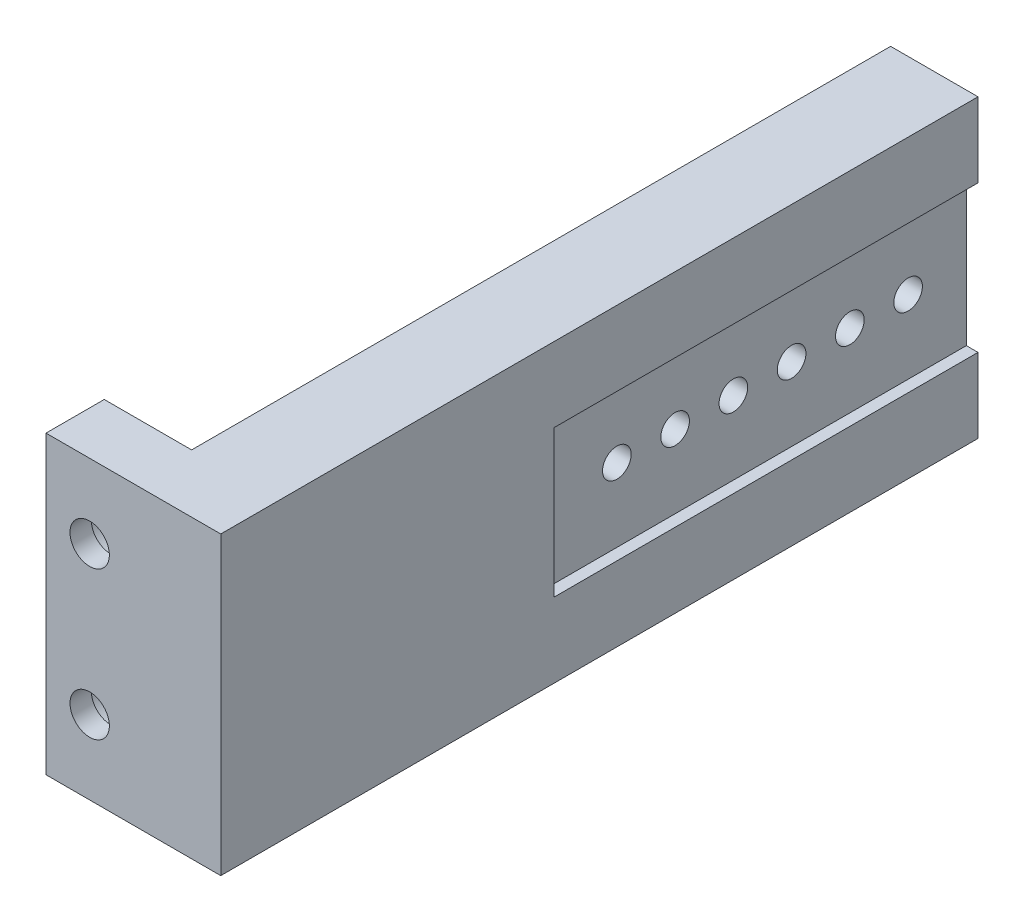
ISO-10303-21;
HEADER;
FILE_DESCRIPTION(('STEP AP214'),'2;1');
FILE_NAME('part.step','',(''),(''),'','','');
FILE_SCHEMA(('AUTOMOTIVE_DESIGN { 1 0 10303 214 1 1 1 1 }'));
ENDSEC;
DATA;
#1=APPLICATION_CONTEXT('core data for automotive mechanical design processes');
#2=APPLICATION_PROTOCOL_DEFINITION('international standard','automotive_design',2000,#1);
#3=PRODUCT_CONTEXT('',#1,'mechanical');
#4=PRODUCT('Part','Part','',(#3));
#5=PRODUCT_RELATED_PRODUCT_CATEGORY('part','',(#4));
#6=PRODUCT_DEFINITION_FORMATION('','',#4);
#7=PRODUCT_DEFINITION_CONTEXT('part definition',#1,'design');
#8=PRODUCT_DEFINITION('design','',#6,#7);
#9=PRODUCT_DEFINITION_SHAPE('','',#8);
#10=(LENGTH_UNIT() NAMED_UNIT(*) SI_UNIT(.MILLI.,.METRE.));
#11=(NAMED_UNIT(*) PLANE_ANGLE_UNIT() SI_UNIT($,.RADIAN.));
#12=(NAMED_UNIT(*) SI_UNIT($,.STERADIAN.) SOLID_ANGLE_UNIT());
#13=UNCERTAINTY_MEASURE_WITH_UNIT(LENGTH_MEASURE(1.E-05),#10,'distance_accuracy_value','');
#14=(GEOMETRIC_REPRESENTATION_CONTEXT(3) GLOBAL_UNCERTAINTY_ASSIGNED_CONTEXT((#13)) GLOBAL_UNIT_ASSIGNED_CONTEXT((#10,
#11,#12)) REPRESENTATION_CONTEXT('',''));
#15=CARTESIAN_POINT('',(0.,0.,0.));
#16=DIRECTION('',(0.,0.,1.));
#17=DIRECTION('',(1.,0.,0.));
#18=AXIS2_PLACEMENT_3D('',#15,#16,#17);
#19=CARTESIAN_POINT('',(-82.9026548672566,50.8,0.));
#20=DIRECTION('',(1.,0.,0.));
#21=DIRECTION('',(0.,0.,-1.));
#22=AXIS2_PLACEMENT_3D('',#19,#20,#21);
#23=PLANE('',#22);
#24=CARTESIAN_POINT('',(-82.9026548672566,25.4,-13.5132743362832));
#25=DIRECTION('',(1.,0.,0.));
#26=DIRECTION('',(0.,0.,-1.));
#27=AXIS2_PLACEMENT_3D('',#24,#25,#26);
#28=CIRCLE('',#27,2.45744999999999);
#29=CARTESIAN_POINT('',(-82.9026548672566,25.4,-15.9707243362832));
#30=VERTEX_POINT('',#29);
#31=EDGE_CURVE('E11',#30,#30,#28,.T.);
#32=ORIENTED_EDGE('',*,*,#31,.T.);
#33=EDGE_LOOP('',(#32));
#34=FACE_BOUND('',#33,.T.);
#35=CARTESIAN_POINT('',(-82.9026548672566,25.4,-23.5132743362832));
#36=DIRECTION('',(1.,0.,0.));
#37=DIRECTION('',(0.,0.,-1.));
#38=AXIS2_PLACEMENT_3D('',#35,#36,#37);
#39=CIRCLE('',#38,2.45744999999999);
#40=CARTESIAN_POINT('',(-82.9026548672566,25.4,-25.9707243362832));
#41=VERTEX_POINT('',#40);
#42=EDGE_CURVE('E45',#41,#41,#39,.T.);
#43=ORIENTED_EDGE('',*,*,#42,.T.);
#44=EDGE_LOOP('',(#43));
#45=FACE_BOUND('',#44,.T.);
#46=CARTESIAN_POINT('',(-82.9026548672566,25.4,-53.5132743362832));
#47=DIRECTION('',(1.,0.,0.));
#48=DIRECTION('',(0.,0.,-1.));
#49=AXIS2_PLACEMENT_3D('',#46,#47,#48);
#50=CIRCLE('',#49,2.45744999999999);
#51=CARTESIAN_POINT('',(-82.9026548672566,25.4,-55.9707243362832));
#52=VERTEX_POINT('',#51);
#53=EDGE_CURVE('E272',#52,#52,#50,.T.);
#54=ORIENTED_EDGE('',*,*,#53,.T.);
#55=EDGE_LOOP('',(#54));
#56=FACE_BOUND('',#55,.T.);
#57=CARTESIAN_POINT('',(-82.9026548672566,25.4,-63.5132743362832));
#58=DIRECTION('',(1.,0.,0.));
#59=DIRECTION('',(0.,0.,-1.));
#60=AXIS2_PLACEMENT_3D('',#57,#58,#59);
#61=CIRCLE('',#60,2.45744999999999);
#62=CARTESIAN_POINT('',(-82.9026548672566,25.4,-65.9707243362832));
#63=VERTEX_POINT('',#62);
#64=EDGE_CURVE('E269',#63,#63,#61,.T.);
#65=ORIENTED_EDGE('',*,*,#64,.T.);
#66=EDGE_LOOP('',(#65));
#67=FACE_BOUND('',#66,.T.);
#68=CARTESIAN_POINT('',(-82.9026548672566,25.4,-43.5132743362832));
#69=DIRECTION('',(1.,0.,0.));
#70=DIRECTION('',(0.,0.,-1.));
#71=AXIS2_PLACEMENT_3D('',#68,#69,#70);
#72=CIRCLE('',#71,2.45744999999999);
#73=CARTESIAN_POINT('',(-82.9026548672566,25.4,-45.9707243362832));
#74=VERTEX_POINT('',#73);
#75=EDGE_CURVE('E266',#74,#74,#72,.T.);
#76=ORIENTED_EDGE('',*,*,#75,.T.);
#77=EDGE_LOOP('',(#76));
#78=FACE_BOUND('',#77,.T.);
#79=CARTESIAN_POINT('',(-82.9026548672566,25.4,-33.5132743362832));
#80=DIRECTION('',(1.,0.,0.));
#81=DIRECTION('',(0.,0.,-1.));
#82=AXIS2_PLACEMENT_3D('',#79,#80,#81);
#83=CIRCLE('',#82,2.45744999999999);
#84=CARTESIAN_POINT('',(-82.9026548672566,25.4,-35.9707243362832));
#85=VERTEX_POINT('',#84);
#86=EDGE_CURVE('E263',#85,#85,#83,.T.);
#87=ORIENTED_EDGE('',*,*,#86,.T.);
#88=EDGE_LOOP('',(#87));
#89=FACE_BOUND('',#88,.T.);
#90=DIRECTION('',(0.,0.,1.));
#91=VECTOR('',#90,1.);
#92=CARTESIAN_POINT('',(-82.9026548672566,22.7,36.4867256637168));
#93=LINE('',#92,#91);
#94=CARTESIAN_POINT('',(-82.9026548672566,22.7,10.5059635501835));
#95=VERTEX_POINT('',#94);
#96=CARTESIAN_POINT('',(-82.9026548672566,22.7,46.4867256637168));
#97=VERTEX_POINT('',#96);
#98=EDGE_CURVE('E220',#95,#97,#93,.T.);
#99=ORIENTED_EDGE('',*,*,#98,.F.);
#100=DIRECTION('',(0.,1.,0.));
#101=VECTOR('',#100,1.);
#102=CARTESIAN_POINT('',(-82.9026548672566,50.8,10.5059635501835));
#103=LINE('',#102,#101);
#104=CARTESIAN_POINT('',(-82.9026548672566,28.1,10.5059635501835));
#105=VERTEX_POINT('',#104);
#106=EDGE_CURVE('E207',#105,#95,#103,.F.);
#107=ORIENTED_EDGE('',*,*,#106,.F.);
#108=DIRECTION('',(0.,0.,1.));
#109=VECTOR('',#108,1.);
#110=CARTESIAN_POINT('',(-82.9026548672566,28.1,36.4867256637168));
#111=LINE('',#110,#109);
#112=CARTESIAN_POINT('',(-82.9026548672566,28.1,46.4867256637168));
#113=VERTEX_POINT('',#112);
#114=EDGE_CURVE('E209',#105,#113,#111,.T.);
#115=ORIENTED_EDGE('',*,*,#114,.T.);
#116=DIRECTION('',(0.,-1.,0.));
#117=VECTOR('',#116,1.);
#118=CARTESIAN_POINT('',(-82.9026548672566,50.8,46.4867256637168));
#119=LINE('',#118,#117);
#120=CARTESIAN_POINT('',(-82.9026548672566,50.8,46.4867256637168));
#121=VERTEX_POINT('',#120);
#122=EDGE_CURVE('E191',#121,#113,#119,.T.);
#123=ORIENTED_EDGE('',*,*,#122,.F.);
#124=DIRECTION('',(0.,0.,1.));
#125=VECTOR('',#124,1.);
#126=CARTESIAN_POINT('',(-82.9026548672566,50.8,0.));
#127=LINE('',#126,#125);
#128=CARTESIAN_POINT('',(-82.9026548672566,50.8,-73.5132743362832));
#129=VERTEX_POINT('',#128);
#130=EDGE_CURVE('E299',#129,#121,#127,.T.);
#131=ORIENTED_EDGE('',*,*,#130,.F.);
#132=DIRECTION('',(0.,-1.,0.));
#133=VECTOR('',#132,1.);
#134=CARTESIAN_POINT('',(-82.9026548672566,50.8,-73.5132743362832));
#135=LINE('',#134,#133);
#136=CARTESIAN_POINT('',(-82.9026548672566,0.,-73.5132743362832));
#137=VERTEX_POINT('',#136);
#138=EDGE_CURVE('E194',#129,#137,#135,.T.);
#139=ORIENTED_EDGE('',*,*,#138,.T.);
#140=DIRECTION('',(0.,0.,1.));
#141=VECTOR('',#140,1.);
#142=CARTESIAN_POINT('',(-82.9026548672566,0.,0.));
#143=LINE('',#142,#141);
#144=CARTESIAN_POINT('',(-82.9026548672566,0.,46.4867256637168));
#145=VERTEX_POINT('',#144);
#146=EDGE_CURVE('E171',#137,#145,#143,.T.);
#147=ORIENTED_EDGE('',*,*,#146,.T.);
#148=EDGE_CURVE('E190',#97,#145,#119,.T.);
#149=ORIENTED_EDGE('',*,*,#148,.F.);
#150=EDGE_LOOP('',(#99,#107,#115,#123,#131,#139,#147,#149));
#151=FACE_BOUND('',#150,.T.);
#152=ADVANCED_FACE('F35',(#34,#45,#56,#67,#78,#89,#151),#23,.F.);
#153=CARTESIAN_POINT('',(0.,50.8,46.4867256637168));
#154=DIRECTION('',(0.,0.,1.));
#155=DIRECTION('',(1.,0.,0.));
#156=AXIS2_PLACEMENT_3D('',#153,#154,#155);
#157=PLANE('',#156);
#158=CARTESIAN_POINT('',(-90.4026548672566,12.7,46.4867256637168));
#159=DIRECTION('',(0.,0.,-1.));
#160=DIRECTION('',(-1.,0.,0.));
#161=AXIS2_PLACEMENT_3D('',#158,#159,#160);
#162=CIRCLE('',#161,5.55625);
#163=CARTESIAN_POINT('',(-95.9589048672566,12.7,46.4867256637168));
#164=VERTEX_POINT('',#163);
#165=EDGE_CURVE('E275',#164,#164,#162,.T.);
#166=ORIENTED_EDGE('',*,*,#165,.F.);
#167=EDGE_LOOP('',(#166));
#168=FACE_BOUND('',#167,.T.);
#169=DIRECTION('',(-1.,0.,0.));
#170=VECTOR('',#169,1.);
#171=CARTESIAN_POINT('',(-82.9026548672566,22.7,46.4867256637168));
#172=LINE('',#171,#170);
#173=CARTESIAN_POINT('',(-97.9026548672566,22.7,46.4867256637168));
#174=VERTEX_POINT('',#173);
#175=EDGE_CURVE('E215',#97,#174,#172,.T.);
#176=ORIENTED_EDGE('',*,*,#175,.F.);
#177=ORIENTED_EDGE('',*,*,#148,.T.);
#178=DIRECTION('',(-1.,0.,0.));
#179=VECTOR('',#178,1.);
#180=CARTESIAN_POINT('',(0.,0.,46.4867256637168));
#181=LINE('',#180,#179);
#182=CARTESIAN_POINT('',(-97.9026548672566,0.,46.4867256637168));
#183=VERTEX_POINT('',#182);
#184=EDGE_CURVE('E181',#145,#183,#181,.T.);
#185=ORIENTED_EDGE('',*,*,#184,.T.);
#186=DIRECTION('',(0.,-1.,0.));
#187=VECTOR('',#186,1.);
#188=CARTESIAN_POINT('',(-97.9026548672566,50.8,46.4867256637168));
#189=LINE('',#188,#187);
#190=EDGE_CURVE('E186',#174,#183,#189,.T.);
#191=ORIENTED_EDGE('',*,*,#190,.F.);
#192=EDGE_LOOP('',(#176,#177,#185,#191));
#193=FACE_BOUND('',#192,.T.);
#194=ADVANCED_FACE('F328',(#168,#193),#157,.F.);
#195=CARTESIAN_POINT('',(-90.4026548672566,38.1,46.4867256637168));
#196=DIRECTION('',(0.,0.,-1.));
#197=DIRECTION('',(-1.,0.,0.));
#198=AXIS2_PLACEMENT_3D('',#195,#196,#197);
#199=CIRCLE('',#198,5.55625);
#200=CARTESIAN_POINT('',(-95.9589048672566,38.1,46.4867256637168));
#201=VERTEX_POINT('',#200);
#202=EDGE_CURVE('E287',#201,#201,#199,.T.);
#203=ORIENTED_EDGE('',*,*,#202,.F.);
#204=EDGE_LOOP('',(#203));
#205=FACE_BOUND('',#204,.T.);
#206=DIRECTION('',(1.,0.,0.));
#207=VECTOR('',#206,1.);
#208=CARTESIAN_POINT('',(-82.9026548672566,28.1,46.4867256637168));
#209=LINE('',#208,#207);
#210=CARTESIAN_POINT('',(-97.9026548672566,28.1,46.4867256637168));
#211=VERTEX_POINT('',#210);
#212=EDGE_CURVE('E208',#211,#113,#209,.T.);
#213=ORIENTED_EDGE('',*,*,#212,.F.);
#214=CARTESIAN_POINT('',(-97.9026548672566,50.8,46.4867256637168));
#215=VERTEX_POINT('',#214);
#216=EDGE_CURVE('E187',#215,#211,#189,.T.);
#217=ORIENTED_EDGE('',*,*,#216,.F.);
#218=DIRECTION('',(-1.,0.,0.));
#219=VECTOR('',#218,1.);
#220=CARTESIAN_POINT('',(0.,50.8,46.4867256637168));
#221=LINE('',#220,#219);
#222=EDGE_CURVE('E301',#121,#215,#221,.T.);
#223=ORIENTED_EDGE('',*,*,#222,.F.);
#224=ORIENTED_EDGE('',*,*,#122,.T.);
#225=EDGE_LOOP('',(#213,#217,#223,#224));
#226=FACE_BOUND('',#225,.T.);
#227=ADVANCED_FACE('F314',(#205,#226),#157,.F.);
#228=CARTESIAN_POINT('',(-67.9026548672567,25.4,-13.5132743362832));
#229=DIRECTION('',(1.,0.,0.));
#230=DIRECTION('',(0.,0.,-1.));
#231=AXIS2_PLACEMENT_3D('',#228,#229,#230);
#232=CYLINDRICAL_SURFACE('',#231,2.45744999999999);
#233=CARTESIAN_POINT('',(-69.9026548672566,25.4,-13.5132743362832));
#234=DIRECTION('',(-1.,0.,0.));
#235=DIRECTION('',(0.,0.,1.));
#236=AXIS2_PLACEMENT_3D('',#233,#234,#235);
#237=CIRCLE('',#236,2.45744999999999);
#238=CARTESIAN_POINT('',(-69.9026548672566,25.4,-11.0558243362832));
#239=VERTEX_POINT('',#238);
#240=EDGE_CURVE('E260',#239,#239,#237,.F.);
#241=ORIENTED_EDGE('',*,*,#240,.T.);
#242=EDGE_LOOP('',(#241));
#243=FACE_BOUND('',#242,.T.);
#244=ORIENTED_EDGE('',*,*,#31,.F.);
#245=EDGE_LOOP('',(#244));
#246=FACE_BOUND('',#245,.T.);
#247=ADVANCED_FACE('F358',(#243,#246),#232,.F.);
#248=CARTESIAN_POINT('',(-67.9026548672567,25.4,-23.5132743362832));
#249=DIRECTION('',(1.,0.,0.));
#250=DIRECTION('',(0.,0.,-1.));
#251=AXIS2_PLACEMENT_3D('',#248,#249,#250);
#252=CYLINDRICAL_SURFACE('',#251,2.45744999999999);
#253=CARTESIAN_POINT('',(-69.9026548672566,25.4,-23.5132743362832));
#254=DIRECTION('',(-1.,0.,0.));
#255=DIRECTION('',(0.,0.,1.));
#256=AXIS2_PLACEMENT_3D('',#253,#254,#255);
#257=CIRCLE('',#256,2.45744999999999);
#258=CARTESIAN_POINT('',(-69.9026548672566,25.4,-21.0558243362832));
#259=VERTEX_POINT('',#258);
#260=EDGE_CURVE('E257',#259,#259,#257,.F.);
#261=ORIENTED_EDGE('',*,*,#260,.T.);
#262=EDGE_LOOP('',(#261));
#263=FACE_BOUND('',#262,.T.);
#264=ORIENTED_EDGE('',*,*,#42,.F.);
#265=EDGE_LOOP('',(#264));
#266=FACE_BOUND('',#265,.T.);
#267=ADVANCED_FACE('F361',(#263,#266),#252,.F.);
#268=CARTESIAN_POINT('',(-67.9026548672566,50.8,0.));
#269=DIRECTION('',(1.,0.,0.));
#270=DIRECTION('',(0.,0.,-1.));
#271=AXIS2_PLACEMENT_3D('',#268,#269,#270);
#272=PLANE('',#271);
#273=DIRECTION('',(0.,0.,-1.));
#274=VECTOR('',#273,1.);
#275=CARTESIAN_POINT('',(-67.9026548672567,12.8,-73.5132743362832));
#276=LINE('',#275,#274);
#277=CARTESIAN_POINT('',(-67.9026548672566,12.8,-0.713274336283167));
#278=VERTEX_POINT('',#277);
#279=CARTESIAN_POINT('',(-67.9026548672567,12.8,-73.5132743362832));
#280=VERTEX_POINT('',#279);
#281=EDGE_CURVE('E227',#278,#280,#276,.T.);
#282=ORIENTED_EDGE('',*,*,#281,.F.);
#283=DIRECTION('',(0.,-1.,0.));
#284=VECTOR('',#283,1.);
#285=CARTESIAN_POINT('',(-67.9026548672566,38.,-0.713274336283168));
#286=LINE('',#285,#284);
#287=CARTESIAN_POINT('',(-67.9026548672566,38.,-0.713274336283168));
#288=VERTEX_POINT('',#287);
#289=EDGE_CURVE('E238',#288,#278,#286,.T.);
#290=ORIENTED_EDGE('',*,*,#289,.F.);
#291=DIRECTION('',(0.,0.,1.));
#292=VECTOR('',#291,1.);
#293=CARTESIAN_POINT('',(-67.9026548672567,38.,-73.5132743362832));
#294=LINE('',#293,#292);
#295=CARTESIAN_POINT('',(-67.9026548672567,38.,-73.5132743362832));
#296=VERTEX_POINT('',#295);
#297=EDGE_CURVE('E222',#296,#288,#294,.T.);
#298=ORIENTED_EDGE('',*,*,#297,.F.);
#299=DIRECTION('',(0.,-1.,0.));
#300=VECTOR('',#299,1.);
#301=CARTESIAN_POINT('',(-67.9026548672567,50.8,-73.5132743362832));
#302=LINE('',#301,#300);
#303=CARTESIAN_POINT('',(-67.9026548672567,50.8,-73.5132743362832));
#304=VERTEX_POINT('',#303);
#305=EDGE_CURVE('E197',#304,#296,#302,.T.);
#306=ORIENTED_EDGE('',*,*,#305,.F.);
#307=DIRECTION('',(0.,0.,1.));
#308=VECTOR('',#307,1.);
#309=CARTESIAN_POINT('',(-67.9026548672566,50.8,0.));
#310=LINE('',#309,#308);
#311=CARTESIAN_POINT('',(-67.9026548672566,50.8,56.4867256637168));
#312=VERTEX_POINT('',#311);
#313=EDGE_CURVE('E151',#304,#312,#310,.T.);
#314=ORIENTED_EDGE('',*,*,#313,.T.);
#315=DIRECTION('',(0.,-1.,0.));
#316=VECTOR('',#315,1.);
#317=CARTESIAN_POINT('',(-67.9026548672566,50.8,56.4867256637168));
#318=LINE('',#317,#316);
#319=CARTESIAN_POINT('',(-67.9026548672566,0.,56.4867256637168));
#320=VERTEX_POINT('',#319);
#321=EDGE_CURVE('E142',#312,#320,#318,.T.);
#322=ORIENTED_EDGE('',*,*,#321,.T.);
#323=DIRECTION('',(0.,0.,1.));
#324=VECTOR('',#323,1.);
#325=CARTESIAN_POINT('',(-67.9026548672566,0.,0.));
#326=LINE('',#325,#324);
#327=CARTESIAN_POINT('',(-67.9026548672567,0.,-73.5132743362832));
#328=VERTEX_POINT('',#327);
#329=EDGE_CURVE('E148',#328,#320,#326,.T.);
#330=ORIENTED_EDGE('',*,*,#329,.F.);
#331=EDGE_CURVE('E196',#280,#328,#302,.T.);
#332=ORIENTED_EDGE('',*,*,#331,.F.);
#333=EDGE_LOOP('',(#282,#290,#298,#306,#314,#322,#330,#332));
#334=FACE_BOUND('',#333,.T.);
#335=ADVANCED_FACE('F145',(#334),#272,.T.);
#336=CARTESIAN_POINT('',(0.,50.8,-73.5132743362832));
#337=DIRECTION('',(0.,0.,-1.));
#338=DIRECTION('',(-1.,0.,0.));
#339=AXIS2_PLACEMENT_3D('',#336,#337,#338);
#340=PLANE('',#339);
#341=DIRECTION('',(1.,0.,0.));
#342=VECTOR('',#341,1.);
#343=CARTESIAN_POINT('',(-69.9026548672567,12.8,-73.5132743362832));
#344=LINE('',#343,#342);
#345=CARTESIAN_POINT('',(-69.9026548672567,12.8,-73.5132743362832));
#346=VERTEX_POINT('',#345);
#347=EDGE_CURVE('E206',#346,#280,#344,.T.);
#348=ORIENTED_EDGE('',*,*,#347,.T.);
#349=ORIENTED_EDGE('',*,*,#331,.T.);
#350=DIRECTION('',(1.,0.,0.));
#351=VECTOR('',#350,1.);
#352=CARTESIAN_POINT('',(0.,0.,-73.5132743362832));
#353=LINE('',#352,#351);
#354=EDGE_CURVE('E168',#137,#328,#353,.T.);
#355=ORIENTED_EDGE('',*,*,#354,.F.);
#356=ORIENTED_EDGE('',*,*,#138,.F.);
#357=DIRECTION('',(1.,0.,0.));
#358=VECTOR('',#357,1.);
#359=CARTESIAN_POINT('',(0.,50.8,-73.5132743362832));
#360=LINE('',#359,#358);
#361=EDGE_CURVE('E296',#129,#304,#360,.T.);
#362=ORIENTED_EDGE('',*,*,#361,.T.);
#363=ORIENTED_EDGE('',*,*,#305,.T.);
#364=DIRECTION('',(1.,0.,0.));
#365=VECTOR('',#364,1.);
#366=CARTESIAN_POINT('',(-69.9026548672567,38.,-73.5132743362832));
#367=LINE('',#366,#365);
#368=CARTESIAN_POINT('',(-69.9026548672567,38.,-73.5132743362832));
#369=VERTEX_POINT('',#368);
#370=EDGE_CURVE('E235',#369,#296,#367,.T.);
#371=ORIENTED_EDGE('',*,*,#370,.F.);
#372=DIRECTION('',(0.,1.,0.));
#373=VECTOR('',#372,1.);
#374=CARTESIAN_POINT('',(-69.9026548672567,38.,-73.5132743362832));
#375=LINE('',#374,#373);
#376=EDGE_CURVE('E223',#346,#369,#375,.T.);
#377=ORIENTED_EDGE('',*,*,#376,.F.);
#378=EDGE_LOOP('',(#348,#349,#355,#356,#362,#363,#371,#377));
#379=FACE_BOUND('',#378,.T.);
#380=ADVANCED_FACE('F331',(#379),#340,.T.);
#381=CARTESIAN_POINT('',(-97.9026548672566,50.8,0.));
#382=DIRECTION('',(-1.,0.,0.));
#383=DIRECTION('',(0.,0.,1.));
#384=AXIS2_PLACEMENT_3D('',#381,#382,#383);
#385=PLANE('',#384);
#386=DIRECTION('',(0.,0.,-1.));
#387=VECTOR('',#386,1.);
#388=CARTESIAN_POINT('',(-97.9026548672566,0.,0.));
#389=LINE('',#388,#387);
#390=CARTESIAN_POINT('',(-97.9026548672566,0.,56.4867256637168));
#391=VERTEX_POINT('',#390);
#392=EDGE_CURVE('E163',#391,#183,#389,.T.);
#393=ORIENTED_EDGE('',*,*,#392,.F.);
#394=DIRECTION('',(0.,-1.,0.));
#395=VECTOR('',#394,1.);
#396=CARTESIAN_POINT('',(-97.9026548672566,50.8,56.4867256637168));
#397=LINE('',#396,#395);
#398=CARTESIAN_POINT('',(-97.9026548672566,50.8,56.4867256637168));
#399=VERTEX_POINT('',#398);
#400=EDGE_CURVE('E154',#399,#391,#397,.T.);
#401=ORIENTED_EDGE('',*,*,#400,.F.);
#402=DIRECTION('',(0.,0.,-1.));
#403=VECTOR('',#402,1.);
#404=CARTESIAN_POINT('',(-97.9026548672566,50.8,0.));
#405=LINE('',#404,#403);
#406=EDGE_CURVE('E302',#399,#215,#405,.T.);
#407=ORIENTED_EDGE('',*,*,#406,.T.);
#408=ORIENTED_EDGE('',*,*,#216,.T.);
#409=DIRECTION('',(0.,0.,1.));
#410=VECTOR('',#409,1.);
#411=CARTESIAN_POINT('',(-97.9026548672566,28.1,36.4867256637168));
#412=LINE('',#411,#410);
#413=CARTESIAN_POINT('',(-97.9026548672566,28.1,36.4867256637168));
#414=VERTEX_POINT('',#413);
#415=EDGE_CURVE('E211',#414,#211,#412,.T.);
#416=ORIENTED_EDGE('',*,*,#415,.F.);
#417=DIRECTION('',(0.,1.,0.));
#418=VECTOR('',#417,1.);
#419=CARTESIAN_POINT('',(-97.9026548672566,22.7,36.4867256637168));
#420=LINE('',#419,#418);
#421=CARTESIAN_POINT('',(-97.9026548672566,22.7,36.4867256637168));
#422=VERTEX_POINT('',#421);
#423=EDGE_CURVE('E76',#422,#414,#420,.T.);
#424=ORIENTED_EDGE('',*,*,#423,.F.);
#425=DIRECTION('',(0.,0.,1.));
#426=VECTOR('',#425,1.);
#427=CARTESIAN_POINT('',(-97.9026548672566,22.7,36.4867256637168));
#428=LINE('',#427,#426);
#429=EDGE_CURVE('E54',#422,#174,#428,.T.);
#430=ORIENTED_EDGE('',*,*,#429,.T.);
#431=ORIENTED_EDGE('',*,*,#190,.T.);
#432=EDGE_LOOP('',(#393,#401,#407,#408,#416,#424,#430,#431));
#433=FACE_BOUND('',#432,.T.);
#434=ADVANCED_FACE('F315',(#433),#385,.T.);
#435=CARTESIAN_POINT('',(0.,50.8,56.4867256637168));
#436=DIRECTION('',(0.,0.,-1.));
#437=DIRECTION('',(-1.,0.,0.));
#438=AXIS2_PLACEMENT_3D('',#435,#436,#437);
#439=PLANE('',#438);
#440=CARTESIAN_POINT('',(-90.4026548672566,12.7,56.4867256637168));
#441=DIRECTION('',(0.,0.,-1.));
#442=DIRECTION('',(-1.,0.,0.));
#443=AXIS2_PLACEMENT_3D('',#440,#441,#442);
#444=CIRCLE('',#443,3.3782);
#445=CARTESIAN_POINT('',(-93.7808548672566,12.7,56.4867256637168));
#446=VERTEX_POINT('',#445);
#447=EDGE_CURVE('E284',#446,#446,#444,.T.);
#448=ORIENTED_EDGE('',*,*,#447,.T.);
#449=EDGE_LOOP('',(#448));
#450=FACE_BOUND('',#449,.T.);
#451=CARTESIAN_POINT('',(-90.4026548672566,38.1,56.4867256637168));
#452=DIRECTION('',(0.,0.,-1.));
#453=DIRECTION('',(-1.,0.,0.));
#454=AXIS2_PLACEMENT_3D('',#451,#452,#453);
#455=CIRCLE('',#454,3.3782);
#456=CARTESIAN_POINT('',(-93.7808548672566,38.1,56.4867256637168));
#457=VERTEX_POINT('',#456);
#458=EDGE_CURVE('E169',#457,#457,#455,.T.);
#459=ORIENTED_EDGE('',*,*,#458,.T.);
#460=EDGE_LOOP('',(#459));
#461=FACE_BOUND('',#460,.T.);
#462=DIRECTION('',(1.,0.,0.));
#463=VECTOR('',#462,1.);
#464=CARTESIAN_POINT('',(0.,0.,56.4867256637168));
#465=LINE('',#464,#463);
#466=EDGE_CURVE('E158',#391,#320,#465,.T.);
#467=ORIENTED_EDGE('',*,*,#466,.T.);
#468=ORIENTED_EDGE('',*,*,#321,.F.);
#469=DIRECTION('',(1.,0.,0.));
#470=VECTOR('',#469,1.);
#471=CARTESIAN_POINT('',(0.,50.8,56.4867256637168));
#472=LINE('',#471,#470);
#473=EDGE_CURVE('E155',#399,#312,#472,.T.);
#474=ORIENTED_EDGE('',*,*,#473,.F.);
#475=ORIENTED_EDGE('',*,*,#400,.T.);
#476=EDGE_LOOP('',(#467,#468,#474,#475));
#477=FACE_BOUND('',#476,.T.);
#478=ADVANCED_FACE('F159',(#450,#461,#477),#439,.F.);
#479=CARTESIAN_POINT('',(0.,50.8,0.));
#480=DIRECTION('',(0.,1.,0.));
#481=DIRECTION('',(0.,0.,1.));
#482=AXIS2_PLACEMENT_3D('',#479,#480,#481);
#483=PLANE('',#482);
#484=ORIENTED_EDGE('',*,*,#313,.F.);
#485=ORIENTED_EDGE('',*,*,#361,.F.);
#486=ORIENTED_EDGE('',*,*,#130,.T.);
#487=ORIENTED_EDGE('',*,*,#222,.T.);
#488=ORIENTED_EDGE('',*,*,#406,.F.);
#489=ORIENTED_EDGE('',*,*,#473,.T.);
#490=EDGE_LOOP('',(#484,#485,#486,#487,#488,#489));
#491=FACE_BOUND('',#490,.T.);
#492=ADVANCED_FACE('F306',(#491),#483,.T.);
#493=CARTESIAN_POINT('',(0.,0.,0.));
#494=DIRECTION('',(0.,1.,0.));
#495=DIRECTION('',(0.,0.,1.));
#496=AXIS2_PLACEMENT_3D('',#493,#494,#495);
#497=PLANE('',#496);
#498=ORIENTED_EDGE('',*,*,#329,.T.);
#499=ORIENTED_EDGE('',*,*,#466,.F.);
#500=ORIENTED_EDGE('',*,*,#392,.T.);
#501=ORIENTED_EDGE('',*,*,#184,.F.);
#502=ORIENTED_EDGE('',*,*,#146,.F.);
#503=ORIENTED_EDGE('',*,*,#354,.T.);
#504=EDGE_LOOP('',(#498,#499,#500,#501,#502,#503));
#505=FACE_BOUND('',#504,.T.);
#506=ADVANCED_FACE('F165',(#505),#497,.F.);
#507=CARTESIAN_POINT('',(-90.4026548672566,38.1,46.4867256637168));
#508=DIRECTION('',(0.,0.,-1.));
#509=DIRECTION('',(-1.,0.,0.));
#510=AXIS2_PLACEMENT_3D('',#507,#508,#509);
#511=CYLINDRICAL_SURFACE('',#510,3.3782);
#512=ORIENTED_EDGE('',*,*,#458,.F.);
#513=EDGE_LOOP('',(#512));
#514=FACE_BOUND('',#513,.T.);
#515=CARTESIAN_POINT('',(-90.4026548672566,38.1,52.8367256637168));
#516=DIRECTION('',(0.,0.,-1.));
#517=DIRECTION('',(-1.,0.,0.));
#518=AXIS2_PLACEMENT_3D('',#515,#516,#517);
#519=CIRCLE('',#518,3.3782);
#520=CARTESIAN_POINT('',(-93.7808548672566,38.1,52.8367256637168));
#521=VERTEX_POINT('',#520);
#522=EDGE_CURVE('E174',#521,#521,#519,.T.);
#523=ORIENTED_EDGE('',*,*,#522,.T.);
#524=EDGE_LOOP('',(#523));
#525=FACE_BOUND('',#524,.T.);
#526=ADVANCED_FACE('F416',(#514,#525),#511,.F.);
#527=CARTESIAN_POINT('',(-87.0244548672566,38.1,52.8367256637168));
#528=DIRECTION('',(0.,0.,1.));
#529=DIRECTION('',(1.,0.,0.));
#530=AXIS2_PLACEMENT_3D('',#527,#528,#529);
#531=PLANE('',#530);
#532=ORIENTED_EDGE('',*,*,#522,.F.);
#533=EDGE_LOOP('',(#532));
#534=FACE_BOUND('',#533,.T.);
#535=CARTESIAN_POINT('',(-90.4026548672566,38.1,52.8367256637168));
#536=DIRECTION('',(0.,0.,-1.));
#537=DIRECTION('',(-1.,0.,0.));
#538=AXIS2_PLACEMENT_3D('',#535,#536,#537);
#539=CIRCLE('',#538,5.55625);
#540=CARTESIAN_POINT('',(-95.9589048672566,38.1,52.8367256637168));
#541=VERTEX_POINT('',#540);
#542=EDGE_CURVE('E290',#541,#541,#539,.T.);
#543=ORIENTED_EDGE('',*,*,#542,.T.);
#544=EDGE_LOOP('',(#543));
#545=FACE_BOUND('',#544,.T.);
#546=ADVANCED_FACE('F412',(#534,#545),#531,.F.);
#547=CARTESIAN_POINT('',(-90.4026548672566,38.1,46.4867256637168));
#548=DIRECTION('',(0.,0.,-1.));
#549=DIRECTION('',(-1.,0.,0.));
#550=AXIS2_PLACEMENT_3D('',#547,#548,#549);
#551=CYLINDRICAL_SURFACE('',#550,5.55625);
#552=ORIENTED_EDGE('',*,*,#542,.F.);
#553=EDGE_LOOP('',(#552));
#554=FACE_BOUND('',#553,.T.);
#555=ORIENTED_EDGE('',*,*,#202,.T.);
#556=EDGE_LOOP('',(#555));
#557=FACE_BOUND('',#556,.T.);
#558=ADVANCED_FACE('F408',(#554,#557),#551,.F.);
#559=CARTESIAN_POINT('',(-90.4026548672566,12.7,46.4867256637168));
#560=DIRECTION('',(0.,0.,-1.));
#561=DIRECTION('',(-1.,0.,0.));
#562=AXIS2_PLACEMENT_3D('',#559,#560,#561);
#563=CYLINDRICAL_SURFACE('',#562,3.3782);
#564=ORIENTED_EDGE('',*,*,#447,.F.);
#565=EDGE_LOOP('',(#564));
#566=FACE_BOUND('',#565,.T.);
#567=CARTESIAN_POINT('',(-90.4026548672566,12.7,52.8367256637168));
#568=DIRECTION('',(0.,0.,-1.));
#569=DIRECTION('',(-1.,0.,0.));
#570=AXIS2_PLACEMENT_3D('',#567,#568,#569);
#571=CIRCLE('',#570,3.3782);
#572=CARTESIAN_POINT('',(-93.7808548672566,12.7,52.8367256637168));
#573=VERTEX_POINT('',#572);
#574=EDGE_CURVE('E281',#573,#573,#571,.T.);
#575=ORIENTED_EDGE('',*,*,#574,.T.);
#576=EDGE_LOOP('',(#575));
#577=FACE_BOUND('',#576,.T.);
#578=ADVANCED_FACE('F404',(#566,#577),#563,.F.);
#579=CARTESIAN_POINT('',(-87.0244548672566,12.7,52.8367256637168));
#580=DIRECTION('',(0.,0.,1.));
#581=DIRECTION('',(1.,0.,0.));
#582=AXIS2_PLACEMENT_3D('',#579,#580,#581);
#583=PLANE('',#582);
#584=ORIENTED_EDGE('',*,*,#574,.F.);
#585=EDGE_LOOP('',(#584));
#586=FACE_BOUND('',#585,.T.);
#587=CARTESIAN_POINT('',(-90.4026548672566,12.7,52.8367256637168));
#588=DIRECTION('',(0.,0.,-1.));
#589=DIRECTION('',(-1.,0.,0.));
#590=AXIS2_PLACEMENT_3D('',#587,#588,#589);
#591=CIRCLE('',#590,5.55625);
#592=CARTESIAN_POINT('',(-95.9589048672566,12.7,52.8367256637168));
#593=VERTEX_POINT('',#592);
#594=EDGE_CURVE('E278',#593,#593,#591,.T.);
#595=ORIENTED_EDGE('',*,*,#594,.T.);
#596=EDGE_LOOP('',(#595));
#597=FACE_BOUND('',#596,.T.);
#598=ADVANCED_FACE('F400',(#586,#597),#583,.F.);
#599=CARTESIAN_POINT('',(-90.4026548672566,12.7,46.4867256637168));
#600=DIRECTION('',(0.,0.,-1.));
#601=DIRECTION('',(-1.,0.,0.));
#602=AXIS2_PLACEMENT_3D('',#599,#600,#601);
#603=CYLINDRICAL_SURFACE('',#602,5.55625);
#604=ORIENTED_EDGE('',*,*,#594,.F.);
#605=EDGE_LOOP('',(#604));
#606=FACE_BOUND('',#605,.T.);
#607=ORIENTED_EDGE('',*,*,#165,.T.);
#608=EDGE_LOOP('',(#607));
#609=FACE_BOUND('',#608,.T.);
#610=ADVANCED_FACE('F396',(#606,#609),#603,.F.);
#611=CARTESIAN_POINT('',(-67.9026548672567,25.4,-53.5132743362832));
#612=DIRECTION('',(1.,0.,0.));
#613=DIRECTION('',(0.,0.,-1.));
#614=AXIS2_PLACEMENT_3D('',#611,#612,#613);
#615=CYLINDRICAL_SURFACE('',#614,2.45744999999999);
#616=CARTESIAN_POINT('',(-69.9026548672567,25.4,-53.5132743362832));
#617=DIRECTION('',(-1.,0.,0.));
#618=DIRECTION('',(0.,0.,1.));
#619=AXIS2_PLACEMENT_3D('',#616,#617,#618);
#620=CIRCLE('',#619,2.45744999999999);
#621=CARTESIAN_POINT('',(-69.9026548672567,25.4,-51.0558243362832));
#622=VERTEX_POINT('',#621);
#623=EDGE_CURVE('E254',#622,#622,#620,.F.);
#624=ORIENTED_EDGE('',*,*,#623,.T.);
#625=EDGE_LOOP('',(#624));
#626=FACE_BOUND('',#625,.T.);
#627=ORIENTED_EDGE('',*,*,#53,.F.);
#628=EDGE_LOOP('',(#627));
#629=FACE_BOUND('',#628,.T.);
#630=ADVANCED_FACE('F392',(#626,#629),#615,.F.);
#631=CARTESIAN_POINT('',(-67.9026548672567,25.4,-63.5132743362832));
#632=DIRECTION('',(1.,0.,0.));
#633=DIRECTION('',(0.,0.,-1.));
#634=AXIS2_PLACEMENT_3D('',#631,#632,#633);
#635=CYLINDRICAL_SURFACE('',#634,2.45744999999999);
#636=CARTESIAN_POINT('',(-69.9026548672567,25.4,-63.5132743362832));
#637=DIRECTION('',(-1.,0.,0.));
#638=DIRECTION('',(0.,0.,1.));
#639=AXIS2_PLACEMENT_3D('',#636,#637,#638);
#640=CIRCLE('',#639,2.45744999999999);
#641=CARTESIAN_POINT('',(-69.9026548672567,25.4,-61.0558243362832));
#642=VERTEX_POINT('',#641);
#643=EDGE_CURVE('E251',#642,#642,#640,.F.);
#644=ORIENTED_EDGE('',*,*,#643,.T.);
#645=EDGE_LOOP('',(#644));
#646=FACE_BOUND('',#645,.T.);
#647=ORIENTED_EDGE('',*,*,#64,.F.);
#648=EDGE_LOOP('',(#647));
#649=FACE_BOUND('',#648,.T.);
#650=ADVANCED_FACE('F384',(#646,#649),#635,.F.);
#651=CARTESIAN_POINT('',(-67.9026548672567,25.4,-43.5132743362832));
#652=DIRECTION('',(1.,0.,0.));
#653=DIRECTION('',(0.,0.,-1.));
#654=AXIS2_PLACEMENT_3D('',#651,#652,#653);
#655=CYLINDRICAL_SURFACE('',#654,2.45744999999999);
#656=CARTESIAN_POINT('',(-69.9026548672567,25.4,-43.5132743362832));
#657=DIRECTION('',(-1.,0.,0.));
#658=DIRECTION('',(0.,0.,1.));
#659=AXIS2_PLACEMENT_3D('',#656,#657,#658);
#660=CIRCLE('',#659,2.45744999999999);
#661=CARTESIAN_POINT('',(-69.9026548672567,25.4,-41.0558243362832));
#662=VERTEX_POINT('',#661);
#663=EDGE_CURVE('E205',#662,#662,#660,.F.);
#664=ORIENTED_EDGE('',*,*,#663,.T.);
#665=EDGE_LOOP('',(#664));
#666=FACE_BOUND('',#665,.T.);
#667=ORIENTED_EDGE('',*,*,#75,.F.);
#668=EDGE_LOOP('',(#667));
#669=FACE_BOUND('',#668,.T.);
#670=ADVANCED_FACE('F378',(#666,#669),#655,.F.);
#671=CARTESIAN_POINT('',(-67.9026548672567,25.4,-33.5132743362832));
#672=DIRECTION('',(1.,0.,0.));
#673=DIRECTION('',(0.,0.,-1.));
#674=AXIS2_PLACEMENT_3D('',#671,#672,#673);
#675=CYLINDRICAL_SURFACE('',#674,2.45744999999999);
#676=CARTESIAN_POINT('',(-69.9026548672566,25.4,-33.5132743362832));
#677=DIRECTION('',(-1.,0.,0.));
#678=DIRECTION('',(0.,0.,1.));
#679=AXIS2_PLACEMENT_3D('',#676,#677,#678);
#680=CIRCLE('',#679,2.45744999999999);
#681=CARTESIAN_POINT('',(-69.9026548672566,25.4,-31.0558243362832));
#682=VERTEX_POINT('',#681);
#683=EDGE_CURVE('E202',#682,#682,#680,.F.);
#684=ORIENTED_EDGE('',*,*,#683,.T.);
#685=EDGE_LOOP('',(#684));
#686=FACE_BOUND('',#685,.T.);
#687=ORIENTED_EDGE('',*,*,#86,.F.);
#688=EDGE_LOOP('',(#687));
#689=FACE_BOUND('',#688,.T.);
#690=ADVANCED_FACE('F349',(#686,#689),#675,.F.);
#691=CARTESIAN_POINT('',(-69.9026548672566,0.,0.));
#692=DIRECTION('',(-1.,0.,0.));
#693=DIRECTION('',(0.,0.,1.));
#694=AXIS2_PLACEMENT_3D('',#691,#692,#693);
#695=PLANE('',#694);
#696=ORIENTED_EDGE('',*,*,#260,.F.);
#697=EDGE_LOOP('',(#696));
#698=FACE_BOUND('',#697,.T.);
#699=ORIENTED_EDGE('',*,*,#643,.F.);
#700=EDGE_LOOP('',(#699));
#701=FACE_BOUND('',#700,.T.);
#702=ORIENTED_EDGE('',*,*,#683,.F.);
#703=EDGE_LOOP('',(#702));
#704=FACE_BOUND('',#703,.T.);
#705=ORIENTED_EDGE('',*,*,#376,.T.);
#706=DIRECTION('',(0.,0.,1.));
#707=VECTOR('',#706,1.);
#708=CARTESIAN_POINT('',(-69.9026548672567,38.,-73.5132743362832));
#709=LINE('',#708,#707);
#710=CARTESIAN_POINT('',(-69.9026548672566,38.,-0.713274336283168));
#711=VERTEX_POINT('',#710);
#712=EDGE_CURVE('E226',#369,#711,#709,.T.);
#713=ORIENTED_EDGE('',*,*,#712,.T.);
#714=DIRECTION('',(0.,-1.,0.));
#715=VECTOR('',#714,1.);
#716=CARTESIAN_POINT('',(-69.9026548672566,38.,-0.713274336283168));
#717=LINE('',#716,#715);
#718=CARTESIAN_POINT('',(-69.9026548672566,12.8,-0.713274336283167));
#719=VERTEX_POINT('',#718);
#720=EDGE_CURVE('E230',#711,#719,#717,.T.);
#721=ORIENTED_EDGE('',*,*,#720,.T.);
#722=DIRECTION('',(0.,0.,-1.));
#723=VECTOR('',#722,1.);
#724=CARTESIAN_POINT('',(-69.9026548672567,12.8,-73.5132743362832));
#725=LINE('',#724,#723);
#726=EDGE_CURVE('E233',#719,#346,#725,.T.);
#727=ORIENTED_EDGE('',*,*,#726,.T.);
#728=EDGE_LOOP('',(#705,#713,#721,#727));
#729=FACE_BOUND('',#728,.T.);
#730=ORIENTED_EDGE('',*,*,#663,.F.);
#731=EDGE_LOOP('',(#730));
#732=FACE_BOUND('',#731,.T.);
#733=ORIENTED_EDGE('',*,*,#623,.F.);
#734=EDGE_LOOP('',(#733));
#735=FACE_BOUND('',#734,.T.);
#736=ORIENTED_EDGE('',*,*,#240,.F.);
#737=EDGE_LOOP('',(#736));
#738=FACE_BOUND('',#737,.T.);
#739=ADVANCED_FACE('F346',(#698,#701,#704,#729,#732,#735,#738),#695,.F.);
#740=CARTESIAN_POINT('',(-69.9026548672567,12.8,-73.5132743362832));
#741=DIRECTION('',(0.,-1.,0.));
#742=DIRECTION('',(0.,0.,-1.));
#743=AXIS2_PLACEMENT_3D('',#740,#741,#742);
#744=PLANE('',#743);
#745=ORIENTED_EDGE('',*,*,#281,.T.);
#746=ORIENTED_EDGE('',*,*,#347,.F.);
#747=ORIENTED_EDGE('',*,*,#726,.F.);
#748=DIRECTION('',(1.,0.,0.));
#749=VECTOR('',#748,1.);
#750=CARTESIAN_POINT('',(-69.9026548672566,12.8,-0.713274336283167));
#751=LINE('',#750,#749);
#752=EDGE_CURVE('E244',#719,#278,#751,.T.);
#753=ORIENTED_EDGE('',*,*,#752,.T.);
#754=EDGE_LOOP('',(#745,#746,#747,#753));
#755=FACE_BOUND('',#754,.T.);
#756=ADVANCED_FACE('F337',(#755),#744,.F.);
#757=CARTESIAN_POINT('',(-69.9026548672566,38.,-0.713274336283168));
#758=DIRECTION('',(0.,0.,1.));
#759=DIRECTION('',(1.,0.,0.));
#760=AXIS2_PLACEMENT_3D('',#757,#758,#759);
#761=PLANE('',#760);
#762=ORIENTED_EDGE('',*,*,#289,.T.);
#763=ORIENTED_EDGE('',*,*,#752,.F.);
#764=ORIENTED_EDGE('',*,*,#720,.F.);
#765=DIRECTION('',(1.,0.,0.));
#766=VECTOR('',#765,1.);
#767=CARTESIAN_POINT('',(-69.9026548672566,38.,-0.713274336283168));
#768=LINE('',#767,#766);
#769=EDGE_CURVE('E246',#711,#288,#768,.T.);
#770=ORIENTED_EDGE('',*,*,#769,.T.);
#771=EDGE_LOOP('',(#762,#763,#764,#770));
#772=FACE_BOUND('',#771,.T.);
#773=ADVANCED_FACE('F341',(#772),#761,.F.);
#774=CARTESIAN_POINT('',(-69.9026548672567,38.,-73.5132743362832));
#775=DIRECTION('',(0.,1.,0.));
#776=DIRECTION('',(0.,0.,1.));
#777=AXIS2_PLACEMENT_3D('',#774,#775,#776);
#778=PLANE('',#777);
#779=ORIENTED_EDGE('',*,*,#297,.T.);
#780=ORIENTED_EDGE('',*,*,#769,.F.);
#781=ORIENTED_EDGE('',*,*,#712,.F.);
#782=ORIENTED_EDGE('',*,*,#370,.T.);
#783=EDGE_LOOP('',(#779,#780,#781,#782));
#784=FACE_BOUND('',#783,.T.);
#785=ADVANCED_FACE('F343',(#784),#778,.F.);
#786=CARTESIAN_POINT('',(-82.9026548672566,22.7,36.4867256637168));
#787=DIRECTION('',(0.,1.,0.));
#788=DIRECTION('',(0.,0.,1.));
#789=AXIS2_PLACEMENT_3D('',#786,#787,#788);
#790=PLANE('',#789);
#791=ORIENTED_EDGE('',*,*,#175,.T.);
#792=ORIENTED_EDGE('',*,*,#429,.F.);
#793=DIRECTION('',(0.499999999999998,0.,-0.86602540378444));
#794=VECTOR('',#793,1.);
#795=CARTESIAN_POINT('',(-97.9026548672566,22.7,36.4867256637168));
#796=LINE('',#795,#794);
#797=EDGE_CURVE('E39',#95,#422,#796,.F.);
#798=ORIENTED_EDGE('',*,*,#797,.F.);
#799=ORIENTED_EDGE('',*,*,#98,.T.);
#800=EDGE_LOOP('',(#791,#792,#798,#799));
#801=FACE_BOUND('',#800,.T.);
#802=ADVANCED_FACE('F324',(#801),#790,.F.);
#803=CARTESIAN_POINT('',(-82.9026548672566,28.1,36.4867256637168));
#804=DIRECTION('',(0.,-1.,0.));
#805=DIRECTION('',(0.,0.,-1.));
#806=AXIS2_PLACEMENT_3D('',#803,#804,#805);
#807=PLANE('',#806);
#808=ORIENTED_EDGE('',*,*,#212,.T.);
#809=ORIENTED_EDGE('',*,*,#114,.F.);
#810=DIRECTION('',(-0.499999999999998,0.,0.86602540378444));
#811=VECTOR('',#810,1.);
#812=CARTESIAN_POINT('',(-97.9026548672566,28.1,36.4867256637168));
#813=LINE('',#812,#811);
#814=EDGE_CURVE('E68',#414,#105,#813,.F.);
#815=ORIENTED_EDGE('',*,*,#814,.F.);
#816=ORIENTED_EDGE('',*,*,#415,.T.);
#817=EDGE_LOOP('',(#808,#809,#815,#816));
#818=FACE_BOUND('',#817,.T.);
#819=ADVANCED_FACE('F317',(#818),#807,.F.);
#820=CARTESIAN_POINT('',(-97.9026548672566,22.7,36.4867256637168));
#821=DIRECTION('',(-0.86602540378444,0.,-0.499999999999998));
#822=DIRECTION('',(-0.499999999999998,0.,0.86602540378444));
#823=AXIS2_PLACEMENT_3D('',#820,#821,#822);
#824=PLANE('',#823);
#825=ORIENTED_EDGE('',*,*,#106,.T.);
#826=ORIENTED_EDGE('',*,*,#797,.T.);
#827=ORIENTED_EDGE('',*,*,#423,.T.);
#828=ORIENTED_EDGE('',*,*,#814,.T.);
#829=EDGE_LOOP('',(#825,#826,#827,#828));
#830=FACE_BOUND('',#829,.T.);
#831=ADVANCED_FACE('F37',(#830),#824,.T.);
#832=CLOSED_SHELL('',(#152,#194,#227,#247,#267,#335,#380,#434,#478,#492,#506,#526,#546,#558,
#578,#598,#610,#630,#650,#670,#690,#739,#756,#773,#785,#802,#819,#831));
#833=MANIFOLD_SOLID_BREP('B2',#832);
#834=ADVANCED_BREP_SHAPE_REPRESENTATION('',(#18,#833),#14);
#835=SHAPE_DEFINITION_REPRESENTATION(#9,#834);
ENDSEC;
END-ISO-10303-21;
